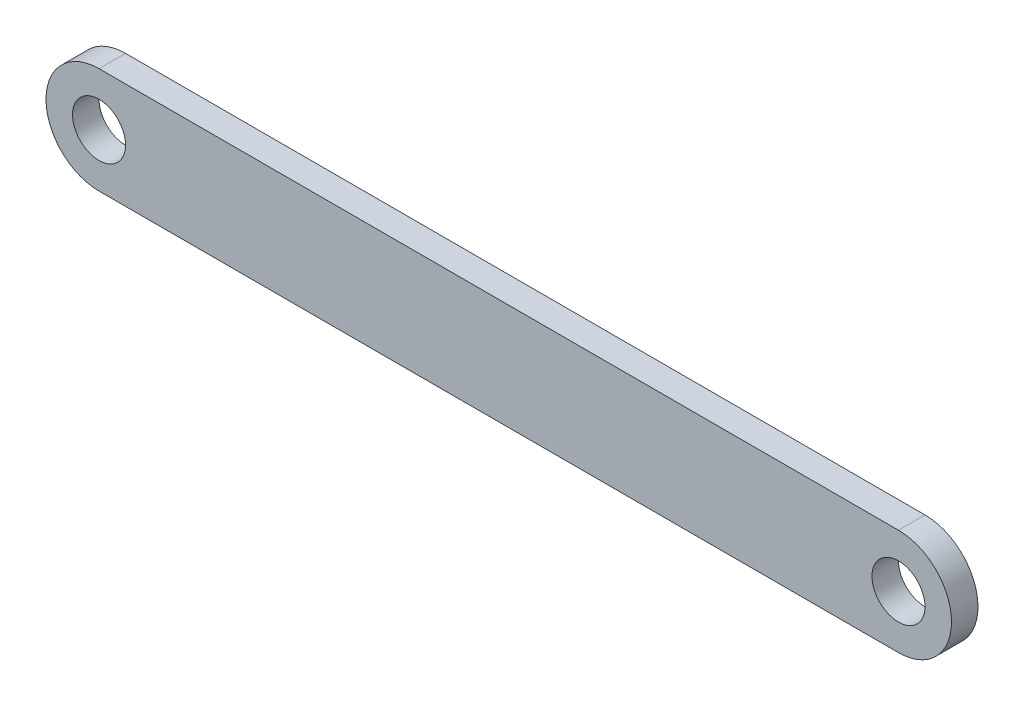
ISO-10303-21;
HEADER;
FILE_DESCRIPTION(('STEP AP214'),'2;1');
FILE_NAME('part.step','',(''),(''),'','','');
FILE_SCHEMA(('AUTOMOTIVE_DESIGN { 1 0 10303 214 1 1 1 1 }'));
ENDSEC;
DATA;
#1=APPLICATION_CONTEXT('core data for automotive mechanical design processes');
#2=APPLICATION_PROTOCOL_DEFINITION('international standard','automotive_design',2000,#1);
#3=PRODUCT_CONTEXT('',#1,'mechanical');
#4=PRODUCT('Part','Part','',(#3));
#5=PRODUCT_RELATED_PRODUCT_CATEGORY('part','',(#4));
#6=PRODUCT_DEFINITION_FORMATION('','',#4);
#7=PRODUCT_DEFINITION_CONTEXT('part definition',#1,'design');
#8=PRODUCT_DEFINITION('design','',#6,#7);
#9=PRODUCT_DEFINITION_SHAPE('','',#8);
#10=(LENGTH_UNIT() NAMED_UNIT(*) SI_UNIT(.MILLI.,.METRE.));
#11=(NAMED_UNIT(*) PLANE_ANGLE_UNIT() SI_UNIT($,.RADIAN.));
#12=(NAMED_UNIT(*) SI_UNIT($,.STERADIAN.) SOLID_ANGLE_UNIT());
#13=UNCERTAINTY_MEASURE_WITH_UNIT(LENGTH_MEASURE(1.E-05),#10,'distance_accuracy_value','');
#14=(GEOMETRIC_REPRESENTATION_CONTEXT(3) GLOBAL_UNCERTAINTY_ASSIGNED_CONTEXT((#13)) GLOBAL_UNIT_ASSIGNED_CONTEXT((#10,
#11,#12)) REPRESENTATION_CONTEXT('',''));
#15=CARTESIAN_POINT('',(0.,0.,0.));
#16=DIRECTION('',(0.,0.,1.));
#17=DIRECTION('',(1.,0.,0.));
#18=AXIS2_PLACEMENT_3D('',#15,#16,#17);
#19=CARTESIAN_POINT('',(0.,-2.,0.5));
#20=DIRECTION('',(0.,1.,0.));
#21=DIRECTION('',(-1.,0.,0.));
#22=AXIS2_PLACEMENT_3D('',#19,#20,#21);
#23=PLANE('',#22);
#24=DIRECTION('',(1.,0.,0.));
#25=VECTOR('',#24,1.);
#26=CARTESIAN_POINT('',(0.,-2.,-0.5));
#27=LINE('',#26,#25);
#28=CARTESIAN_POINT('',(-30.1536,-2.,-0.5));
#29=VERTEX_POINT('',#28);
#30=CARTESIAN_POINT('',(0.,-2.,-0.5));
#31=VERTEX_POINT('',#30);
#32=EDGE_CURVE('E107',#29,#31,#27,.T.);
#33=ORIENTED_EDGE('',*,*,#32,.T.);
#34=DIRECTION('',(0.,0.,-1.));
#35=VECTOR('',#34,1.);
#36=CARTESIAN_POINT('',(0.,-2.,0.5));
#37=LINE('',#36,#35);
#38=CARTESIAN_POINT('',(0.,-2.,0.5));
#39=VERTEX_POINT('',#38);
#40=EDGE_CURVE('E11',#39,#31,#37,.T.);
#41=ORIENTED_EDGE('',*,*,#40,.F.);
#42=DIRECTION('',(1.,0.,0.));
#43=VECTOR('',#42,1.);
#44=CARTESIAN_POINT('',(0.,-2.,0.5));
#45=LINE('',#44,#43);
#46=CARTESIAN_POINT('',(-30.1536,-2.,0.5));
#47=VERTEX_POINT('',#46);
#48=EDGE_CURVE('E86',#47,#39,#45,.T.);
#49=ORIENTED_EDGE('',*,*,#48,.F.);
#50=DIRECTION('',(0.,0.,-1.));
#51=VECTOR('',#50,1.);
#52=CARTESIAN_POINT('',(-30.1536,-2.,0.5));
#53=LINE('',#52,#51);
#54=EDGE_CURVE('E106',#47,#29,#53,.T.);
#55=ORIENTED_EDGE('',*,*,#54,.T.);
#56=EDGE_LOOP('',(#33,#41,#49,#55));
#57=FACE_BOUND('',#56,.T.);
#58=ADVANCED_FACE('F38',(#57),#23,.F.);
#59=CARTESIAN_POINT('',(0.,0.,0.5));
#60=DIRECTION('',(0.,0.,-1.));
#61=DIRECTION('',(-1.,0.,0.));
#62=AXIS2_PLACEMENT_3D('',#59,#60,#61);
#63=CYLINDRICAL_SURFACE('',#62,2.);
#64=CARTESIAN_POINT('',(0.,0.,-0.5));
#65=DIRECTION('',(0.,0.,1.));
#66=DIRECTION('',(1.,0.,0.));
#67=AXIS2_PLACEMENT_3D('',#64,#65,#66);
#68=CIRCLE('',#67,2.);
#69=CARTESIAN_POINT('',(0.,2.,-0.5));
#70=VERTEX_POINT('',#69);
#71=EDGE_CURVE('E91',#31,#70,#68,.T.);
#72=ORIENTED_EDGE('',*,*,#71,.T.);
#73=DIRECTION('',(0.,0.,-1.));
#74=VECTOR('',#73,1.);
#75=CARTESIAN_POINT('',(0.,2.,0.5));
#76=LINE('',#75,#74);
#77=CARTESIAN_POINT('',(0.,2.,0.5));
#78=VERTEX_POINT('',#77);
#79=EDGE_CURVE('E46',#78,#70,#76,.T.);
#80=ORIENTED_EDGE('',*,*,#79,.F.);
#81=CARTESIAN_POINT('',(0.,0.,0.5));
#82=DIRECTION('',(0.,0.,1.));
#83=DIRECTION('',(1.,0.,0.));
#84=AXIS2_PLACEMENT_3D('',#81,#82,#83);
#85=CIRCLE('',#84,2.);
#86=EDGE_CURVE('E80',#39,#78,#85,.T.);
#87=ORIENTED_EDGE('',*,*,#86,.F.);
#88=ORIENTED_EDGE('',*,*,#40,.T.);
#89=EDGE_LOOP('',(#72,#80,#87,#88));
#90=FACE_BOUND('',#89,.T.);
#91=ADVANCED_FACE('F90',(#90),#63,.T.);
#92=CARTESIAN_POINT('',(0.,2.,0.5));
#93=DIRECTION('',(0.,1.,0.));
#94=DIRECTION('',(-1.,0.,0.));
#95=AXIS2_PLACEMENT_3D('',#92,#93,#94);
#96=PLANE('',#95);
#97=DIRECTION('',(1.,0.,0.));
#98=VECTOR('',#97,1.);
#99=CARTESIAN_POINT('',(0.,2.,-0.5));
#100=LINE('',#99,#98);
#101=CARTESIAN_POINT('',(-30.1536,2.,-0.5));
#102=VERTEX_POINT('',#101);
#103=EDGE_CURVE('E111',#102,#70,#100,.T.);
#104=ORIENTED_EDGE('',*,*,#103,.F.);
#105=DIRECTION('',(0.,0.,-1.));
#106=VECTOR('',#105,1.);
#107=CARTESIAN_POINT('',(-30.1536,2.,0.5));
#108=LINE('',#107,#106);
#109=CARTESIAN_POINT('',(-30.1536,2.,0.5));
#110=VERTEX_POINT('',#109);
#111=EDGE_CURVE('E70',#110,#102,#108,.T.);
#112=ORIENTED_EDGE('',*,*,#111,.F.);
#113=DIRECTION('',(1.,0.,0.));
#114=VECTOR('',#113,1.);
#115=CARTESIAN_POINT('',(0.,2.,0.5));
#116=LINE('',#115,#114);
#117=EDGE_CURVE('E84',#110,#78,#116,.T.);
#118=ORIENTED_EDGE('',*,*,#117,.T.);
#119=ORIENTED_EDGE('',*,*,#79,.T.);
#120=EDGE_LOOP('',(#104,#112,#118,#119));
#121=FACE_BOUND('',#120,.T.);
#122=ADVANCED_FACE('F95',(#121),#96,.T.);
#123=CARTESIAN_POINT('',(-30.1536,0.,0.5));
#124=DIRECTION('',(0.,0.,-1.));
#125=DIRECTION('',(-1.,0.,0.));
#126=AXIS2_PLACEMENT_3D('',#123,#124,#125);
#127=CYLINDRICAL_SURFACE('',#126,1.);
#128=CARTESIAN_POINT('',(-30.1536,0.,0.5));
#129=DIRECTION('',(0.,0.,1.));
#130=DIRECTION('',(1.,0.,0.));
#131=AXIS2_PLACEMENT_3D('',#128,#129,#130);
#132=CIRCLE('',#131,1.);
#133=CARTESIAN_POINT('',(-29.1536,0.,0.5));
#134=VERTEX_POINT('',#133);
#135=EDGE_CURVE('E97',#134,#134,#132,.T.);
#136=ORIENTED_EDGE('',*,*,#135,.T.);
#137=EDGE_LOOP('',(#136));
#138=FACE_BOUND('',#137,.T.);
#139=CARTESIAN_POINT('',(-30.1536,0.,-0.5));
#140=DIRECTION('',(0.,0.,1.));
#141=DIRECTION('',(1.,0.,0.));
#142=AXIS2_PLACEMENT_3D('',#139,#140,#141);
#143=CIRCLE('',#142,1.);
#144=CARTESIAN_POINT('',(-29.1536,0.,-0.5));
#145=VERTEX_POINT('',#144);
#146=EDGE_CURVE('E114',#145,#145,#143,.T.);
#147=ORIENTED_EDGE('',*,*,#146,.F.);
#148=EDGE_LOOP('',(#147));
#149=FACE_BOUND('',#148,.T.);
#150=ADVANCED_FACE('F142',(#138,#149),#127,.F.);
#151=CARTESIAN_POINT('',(-30.1536,0.,0.5));
#152=DIRECTION('',(0.,0.,-1.));
#153=DIRECTION('',(-1.,0.,0.));
#154=AXIS2_PLACEMENT_3D('',#151,#152,#153);
#155=CYLINDRICAL_SURFACE('',#154,2.);
#156=CARTESIAN_POINT('',(-30.1536,0.,-0.5));
#157=DIRECTION('',(0.,0.,1.));
#158=DIRECTION('',(1.,0.,0.));
#159=AXIS2_PLACEMENT_3D('',#156,#157,#158);
#160=CIRCLE('',#159,2.);
#161=EDGE_CURVE('E73',#102,#29,#160,.T.);
#162=ORIENTED_EDGE('',*,*,#161,.T.);
#163=ORIENTED_EDGE('',*,*,#54,.F.);
#164=CARTESIAN_POINT('',(-30.1536,0.,0.5));
#165=DIRECTION('',(0.,0.,1.));
#166=DIRECTION('',(1.,0.,0.));
#167=AXIS2_PLACEMENT_3D('',#164,#165,#166);
#168=CIRCLE('',#167,2.);
#169=EDGE_CURVE('E54',#110,#47,#168,.T.);
#170=ORIENTED_EDGE('',*,*,#169,.F.);
#171=ORIENTED_EDGE('',*,*,#111,.T.);
#172=EDGE_LOOP('',(#162,#163,#170,#171));
#173=FACE_BOUND('',#172,.T.);
#174=ADVANCED_FACE('F134',(#173),#155,.T.);
#175=CARTESIAN_POINT('',(0.,0.,0.5));
#176=DIRECTION('',(0.,0.,-1.));
#177=DIRECTION('',(-1.,0.,0.));
#178=AXIS2_PLACEMENT_3D('',#175,#176,#177);
#179=CYLINDRICAL_SURFACE('',#178,1.);
#180=CARTESIAN_POINT('',(0.,0.,0.5));
#181=DIRECTION('',(0.,0.,1.));
#182=DIRECTION('',(1.,0.,0.));
#183=AXIS2_PLACEMENT_3D('',#180,#181,#182);
#184=CIRCLE('',#183,1.);
#185=CARTESIAN_POINT('',(1.,0.,0.5));
#186=VERTEX_POINT('',#185);
#187=EDGE_CURVE('E103',#186,#186,#184,.T.);
#188=ORIENTED_EDGE('',*,*,#187,.T.);
#189=EDGE_LOOP('',(#188));
#190=FACE_BOUND('',#189,.T.);
#191=CARTESIAN_POINT('',(0.,0.,-0.5));
#192=DIRECTION('',(0.,0.,1.));
#193=DIRECTION('',(1.,0.,0.));
#194=AXIS2_PLACEMENT_3D('',#191,#192,#193);
#195=CIRCLE('',#194,1.);
#196=CARTESIAN_POINT('',(1.,0.,-0.5));
#197=VERTEX_POINT('',#196);
#198=EDGE_CURVE('E117',#197,#197,#195,.T.);
#199=ORIENTED_EDGE('',*,*,#198,.F.);
#200=EDGE_LOOP('',(#199));
#201=FACE_BOUND('',#200,.T.);
#202=ADVANCED_FACE('F132',(#190,#201),#179,.F.);
#203=CARTESIAN_POINT('',(0.,0.,0.5));
#204=DIRECTION('',(0.,0.,1.));
#205=DIRECTION('',(1.,0.,0.));
#206=AXIS2_PLACEMENT_3D('',#203,#204,#205);
#207=PLANE('',#206);
#208=ORIENTED_EDGE('',*,*,#48,.T.);
#209=ORIENTED_EDGE('',*,*,#86,.T.);
#210=ORIENTED_EDGE('',*,*,#117,.F.);
#211=ORIENTED_EDGE('',*,*,#169,.T.);
#212=EDGE_LOOP('',(#208,#209,#210,#211));
#213=FACE_BOUND('',#212,.T.);
#214=ORIENTED_EDGE('',*,*,#135,.F.);
#215=EDGE_LOOP('',(#214));
#216=FACE_BOUND('',#215,.T.);
#217=ORIENTED_EDGE('',*,*,#187,.F.);
#218=EDGE_LOOP('',(#217));
#219=FACE_BOUND('',#218,.T.);
#220=ADVANCED_FACE('F81',(#213,#216,#219),#207,.T.);
#221=CARTESIAN_POINT('',(0.,0.,-0.5));
#222=DIRECTION('',(0.,0.,1.));
#223=DIRECTION('',(1.,0.,0.));
#224=AXIS2_PLACEMENT_3D('',#221,#222,#223);
#225=PLANE('',#224);
#226=ORIENTED_EDGE('',*,*,#32,.F.);
#227=ORIENTED_EDGE('',*,*,#161,.F.);
#228=ORIENTED_EDGE('',*,*,#103,.T.);
#229=ORIENTED_EDGE('',*,*,#71,.F.);
#230=EDGE_LOOP('',(#226,#227,#228,#229));
#231=FACE_BOUND('',#230,.T.);
#232=ORIENTED_EDGE('',*,*,#146,.T.);
#233=EDGE_LOOP('',(#232));
#234=FACE_BOUND('',#233,.T.);
#235=ORIENTED_EDGE('',*,*,#198,.T.);
#236=EDGE_LOOP('',(#235));
#237=FACE_BOUND('',#236,.T.);
#238=ADVANCED_FACE('F124',(#231,#234,#237),#225,.F.);
#239=CLOSED_SHELL('',(#58,#91,#122,#150,#174,#202,#220,#238));
#240=MANIFOLD_SOLID_BREP('B2',#239);
#241=ADVANCED_BREP_SHAPE_REPRESENTATION('',(#18,#240),#14);
#242=SHAPE_DEFINITION_REPRESENTATION(#9,#241);
ENDSEC;
END-ISO-10303-21;
